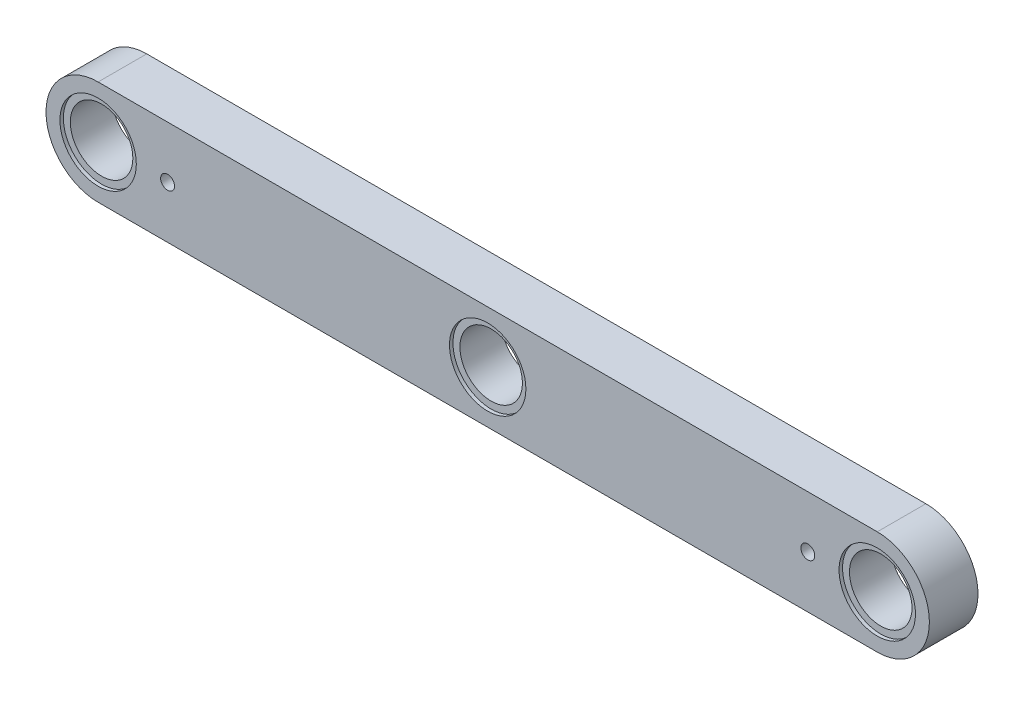
ISO-10303-21;
HEADER;
FILE_DESCRIPTION(('STEP AP214'),'2;1');
FILE_NAME('part.step','',(''),(''),'','','');
FILE_SCHEMA(('AUTOMOTIVE_DESIGN { 1 0 10303 214 1 1 1 1 }'));
ENDSEC;
DATA;
#1=APPLICATION_CONTEXT('core data for automotive mechanical design processes');
#2=APPLICATION_PROTOCOL_DEFINITION('international standard','automotive_design',2000,#1);
#3=PRODUCT_CONTEXT('',#1,'mechanical');
#4=PRODUCT('Part','Part','',(#3));
#5=PRODUCT_RELATED_PRODUCT_CATEGORY('part','',(#4));
#6=PRODUCT_DEFINITION_FORMATION('','',#4);
#7=PRODUCT_DEFINITION_CONTEXT('part definition',#1,'design');
#8=PRODUCT_DEFINITION('design','',#6,#7);
#9=PRODUCT_DEFINITION_SHAPE('','',#8);
#10=(LENGTH_UNIT() NAMED_UNIT(*) SI_UNIT(.MILLI.,.METRE.));
#11=(NAMED_UNIT(*) PLANE_ANGLE_UNIT() SI_UNIT($,.RADIAN.));
#12=(NAMED_UNIT(*) SI_UNIT($,.STERADIAN.) SOLID_ANGLE_UNIT());
#13=UNCERTAINTY_MEASURE_WITH_UNIT(LENGTH_MEASURE(1.E-05),#10,'distance_accuracy_value','');
#14=(GEOMETRIC_REPRESENTATION_CONTEXT(3) GLOBAL_UNCERTAINTY_ASSIGNED_CONTEXT((#13)) GLOBAL_UNIT_ASSIGNED_CONTEXT((#10,
#11,#12)) REPRESENTATION_CONTEXT('',''));
#15=CARTESIAN_POINT('',(0.,0.,0.));
#16=DIRECTION('',(0.,0.,1.));
#17=DIRECTION('',(1.,0.,0.));
#18=AXIS2_PLACEMENT_3D('',#15,#16,#17);
#19=CARTESIAN_POINT('',(-112.155,0.,-7.));
#20=DIRECTION('',(0.,0.,1.));
#21=DIRECTION('',(-1.,0.,0.));
#22=AXIS2_PLACEMENT_3D('',#19,#20,#21);
#23=CYLINDRICAL_SURFACE('',#22,11.);
#24=CARTESIAN_POINT('',(-112.155,0.,7.));
#25=DIRECTION('',(0.,0.,1.));
#26=DIRECTION('',(1.,0.,0.));
#27=AXIS2_PLACEMENT_3D('',#24,#25,#26);
#28=CIRCLE('',#27,11.);
#29=CARTESIAN_POINT('',(-101.155,0.,7.));
#30=VERTEX_POINT('',#29);
#31=EDGE_CURVE('E197',#30,#30,#28,.T.);
#32=ORIENTED_EDGE('',*,*,#31,.T.);
#33=EDGE_LOOP('',(#32));
#34=FACE_BOUND('',#33,.T.);
#35=CARTESIAN_POINT('',(-112.155,0.,6.));
#36=DIRECTION('',(0.,0.,1.));
#37=DIRECTION('',(1.,0.,0.));
#38=AXIS2_PLACEMENT_3D('',#35,#36,#37);
#39=CIRCLE('',#38,11.);
#40=CARTESIAN_POINT('',(-101.155,0.,6.));
#41=VERTEX_POINT('',#40);
#42=EDGE_CURVE('E555',#41,#41,#39,.T.);
#43=ORIENTED_EDGE('',*,*,#42,.F.);
#44=EDGE_LOOP('',(#43));
#45=FACE_BOUND('',#44,.T.);
#46=ADVANCED_FACE('F47',(#34,#45),#23,.F.);
#47=CARTESIAN_POINT('',(0.,0.,-7.));
#48=DIRECTION('',(0.,0.,1.));
#49=DIRECTION('',(-1.,0.,0.));
#50=AXIS2_PLACEMENT_3D('',#47,#48,#49);
#51=CYLINDRICAL_SURFACE('',#50,11.);
#52=CARTESIAN_POINT('',(0.,0.,7.));
#53=DIRECTION('',(0.,0.,1.));
#54=DIRECTION('',(1.,0.,0.));
#55=AXIS2_PLACEMENT_3D('',#52,#53,#54);
#56=CIRCLE('',#55,11.);
#57=CARTESIAN_POINT('',(11.,0.,7.));
#58=VERTEX_POINT('',#57);
#59=EDGE_CURVE('E213',#58,#58,#56,.T.);
#60=ORIENTED_EDGE('',*,*,#59,.T.);
#61=EDGE_LOOP('',(#60));
#62=FACE_BOUND('',#61,.T.);
#63=CARTESIAN_POINT('',(0.,0.,6.));
#64=DIRECTION('',(0.,0.,1.));
#65=DIRECTION('',(1.,0.,0.));
#66=AXIS2_PLACEMENT_3D('',#63,#64,#65);
#67=CIRCLE('',#66,11.);
#68=CARTESIAN_POINT('',(11.,0.,6.));
#69=VERTEX_POINT('',#68);
#70=EDGE_CURVE('E162',#69,#69,#67,.T.);
#71=ORIENTED_EDGE('',*,*,#70,.F.);
#72=EDGE_LOOP('',(#71));
#73=FACE_BOUND('',#72,.T.);
#74=ADVANCED_FACE('F235',(#62,#73),#51,.F.);
#75=CARTESIAN_POINT('',(112.155,0.,-7.));
#76=DIRECTION('',(0.,0.,1.));
#77=DIRECTION('',(-1.,0.,0.));
#78=AXIS2_PLACEMENT_3D('',#75,#76,#77);
#79=CYLINDRICAL_SURFACE('',#78,11.);
#80=CARTESIAN_POINT('',(112.155,0.,7.));
#81=DIRECTION('',(0.,0.,1.));
#82=DIRECTION('',(1.,0.,0.));
#83=AXIS2_PLACEMENT_3D('',#80,#81,#82);
#84=CIRCLE('',#83,11.);
#85=CARTESIAN_POINT('',(123.155,0.,7.));
#86=VERTEX_POINT('',#85);
#87=EDGE_CURVE('E205',#86,#86,#84,.T.);
#88=ORIENTED_EDGE('',*,*,#87,.T.);
#89=EDGE_LOOP('',(#88));
#90=FACE_BOUND('',#89,.T.);
#91=CARTESIAN_POINT('',(112.155,0.,6.));
#92=DIRECTION('',(0.,0.,1.));
#93=DIRECTION('',(1.,0.,0.));
#94=AXIS2_PLACEMENT_3D('',#91,#92,#93);
#95=CIRCLE('',#94,11.);
#96=CARTESIAN_POINT('',(123.155,0.,6.));
#97=VERTEX_POINT('',#96);
#98=EDGE_CURVE('E177',#97,#97,#95,.T.);
#99=ORIENTED_EDGE('',*,*,#98,.F.);
#100=EDGE_LOOP('',(#99));
#101=FACE_BOUND('',#100,.T.);
#102=ADVANCED_FACE('F245',(#90,#101),#79,.F.);
#103=CARTESIAN_POINT('',(112.155,0.,-7.));
#104=DIRECTION('',(0.,0.,-1.));
#105=DIRECTION('',(1.,0.,0.));
#106=AXIS2_PLACEMENT_3D('',#103,#104,#105);
#107=PLANE('',#106);
#108=CARTESIAN_POINT('',(-92.155,0.,-7.));
#109=DIRECTION('',(0.,0.,1.));
#110=DIRECTION('',(1.,0.,0.));
#111=AXIS2_PLACEMENT_3D('',#108,#109,#110);
#112=CIRCLE('',#111,2.);
#113=CARTESIAN_POINT('',(-90.155,0.,-7.));
#114=VERTEX_POINT('',#113);
#115=EDGE_CURVE('E193',#114,#114,#112,.T.);
#116=ORIENTED_EDGE('',*,*,#115,.T.);
#117=EDGE_LOOP('',(#116));
#118=FACE_BOUND('',#117,.T.);
#119=CARTESIAN_POINT('',(112.155,0.,-7.));
#120=DIRECTION('',(0.,0.,1.));
#121=DIRECTION('',(1.,0.,0.));
#122=AXIS2_PLACEMENT_3D('',#119,#120,#121);
#123=CIRCLE('',#122,11.);
#124=CARTESIAN_POINT('',(123.155,0.,-7.));
#125=VERTEX_POINT('',#124);
#126=EDGE_CURVE('E209',#125,#125,#123,.T.);
#127=ORIENTED_EDGE('',*,*,#126,.T.);
#128=EDGE_LOOP('',(#127));
#129=FACE_BOUND('',#128,.T.);
#130=CARTESIAN_POINT('',(112.155,0.,-7.));
#131=DIRECTION('',(0.,0.,1.));
#132=DIRECTION('',(1.,0.,0.));
#133=AXIS2_PLACEMENT_3D('',#130,#131,#132);
#134=CIRCLE('',#133,15.);
#135=CARTESIAN_POINT('',(112.155,-14.9999999999999,-7.));
#136=VERTEX_POINT('',#135);
#137=CARTESIAN_POINT('',(112.155,15.,-7.));
#138=VERTEX_POINT('',#137);
#139=EDGE_CURVE('E110',#136,#138,#134,.T.);
#140=ORIENTED_EDGE('',*,*,#139,.F.);
#141=DIRECTION('',(1.,0.,0.));
#142=VECTOR('',#141,1.);
#143=CARTESIAN_POINT('',(112.155,-14.9999999999999,-7.));
#144=LINE('',#143,#142);
#145=CARTESIAN_POINT('',(-112.155,-15.,-7.));
#146=VERTEX_POINT('',#145);
#147=EDGE_CURVE('E114',#146,#136,#144,.T.);
#148=ORIENTED_EDGE('',*,*,#147,.F.);
#149=CARTESIAN_POINT('',(-112.155,0.,-7.));
#150=DIRECTION('',(0.,0.,1.));
#151=DIRECTION('',(1.,0.,0.));
#152=AXIS2_PLACEMENT_3D('',#149,#150,#151);
#153=CIRCLE('',#152,15.);
#154=CARTESIAN_POINT('',(-112.155,15.,-7.));
#155=VERTEX_POINT('',#154);
#156=EDGE_CURVE('E98',#155,#146,#153,.T.);
#157=ORIENTED_EDGE('',*,*,#156,.F.);
#158=DIRECTION('',(-1.,0.,0.));
#159=VECTOR('',#158,1.);
#160=CARTESIAN_POINT('',(112.155,15.,-7.));
#161=LINE('',#160,#159);
#162=EDGE_CURVE('E105',#138,#155,#161,.T.);
#163=ORIENTED_EDGE('',*,*,#162,.F.);
#164=EDGE_LOOP('',(#140,#148,#157,#163));
#165=FACE_BOUND('',#164,.T.);
#166=CARTESIAN_POINT('',(0.,0.,-7.));
#167=DIRECTION('',(0.,0.,1.));
#168=DIRECTION('',(1.,0.,0.));
#169=AXIS2_PLACEMENT_3D('',#166,#167,#168);
#170=CIRCLE('',#169,11.);
#171=CARTESIAN_POINT('',(11.,0.,-7.));
#172=VERTEX_POINT('',#171);
#173=EDGE_CURVE('E126',#172,#172,#170,.T.);
#174=ORIENTED_EDGE('',*,*,#173,.T.);
#175=EDGE_LOOP('',(#174));
#176=FACE_BOUND('',#175,.T.);
#177=CARTESIAN_POINT('',(-112.155,0.,-7.));
#178=DIRECTION('',(0.,0.,1.));
#179=DIRECTION('',(1.,0.,0.));
#180=AXIS2_PLACEMENT_3D('',#177,#178,#179);
#181=CIRCLE('',#180,11.);
#182=CARTESIAN_POINT('',(-101.155,0.,-7.));
#183=VERTEX_POINT('',#182);
#184=EDGE_CURVE('E201',#183,#183,#181,.T.);
#185=ORIENTED_EDGE('',*,*,#184,.T.);
#186=EDGE_LOOP('',(#185));
#187=FACE_BOUND('',#186,.T.);
#188=CARTESIAN_POINT('',(92.155,0.,-7.));
#189=DIRECTION('',(0.,0.,1.));
#190=DIRECTION('',(1.,0.,0.));
#191=AXIS2_PLACEMENT_3D('',#188,#189,#190);
#192=CIRCLE('',#191,2.);
#193=CARTESIAN_POINT('',(94.155,0.,-7.));
#194=VERTEX_POINT('',#193);
#195=EDGE_CURVE('E185',#194,#194,#192,.T.);
#196=ORIENTED_EDGE('',*,*,#195,.T.);
#197=EDGE_LOOP('',(#196));
#198=FACE_BOUND('',#197,.T.);
#199=ADVANCED_FACE('F112',(#118,#129,#165,#176,#187,#198),#107,.T.);
#200=CARTESIAN_POINT('',(112.155,0.,7.));
#201=DIRECTION('',(0.,0.,-1.));
#202=DIRECTION('',(1.,0.,0.));
#203=AXIS2_PLACEMENT_3D('',#200,#201,#202);
#204=PLANE('',#203);
#205=CARTESIAN_POINT('',(112.155,0.,7.));
#206=DIRECTION('',(0.,0.,1.));
#207=DIRECTION('',(1.,0.,0.));
#208=AXIS2_PLACEMENT_3D('',#205,#206,#207);
#209=CIRCLE('',#208,15.);
#210=CARTESIAN_POINT('',(112.155,-14.9999999999999,7.));
#211=VERTEX_POINT('',#210);
#212=CARTESIAN_POINT('',(112.155,15.,7.));
#213=VERTEX_POINT('',#212);
#214=EDGE_CURVE('E121',#211,#213,#209,.T.);
#215=ORIENTED_EDGE('',*,*,#214,.T.);
#216=DIRECTION('',(-1.,0.,0.));
#217=VECTOR('',#216,1.);
#218=CARTESIAN_POINT('',(112.155,15.,7.));
#219=LINE('',#218,#217);
#220=CARTESIAN_POINT('',(-112.155,15.,7.));
#221=VERTEX_POINT('',#220);
#222=EDGE_CURVE('E125',#213,#221,#219,.T.);
#223=ORIENTED_EDGE('',*,*,#222,.T.);
#224=CARTESIAN_POINT('',(-112.155,0.,7.));
#225=DIRECTION('',(0.,0.,1.));
#226=DIRECTION('',(1.,0.,0.));
#227=AXIS2_PLACEMENT_3D('',#224,#225,#226);
#228=CIRCLE('',#227,15.);
#229=CARTESIAN_POINT('',(-112.155,-15.,7.));
#230=VERTEX_POINT('',#229);
#231=EDGE_CURVE('E101',#221,#230,#228,.T.);
#232=ORIENTED_EDGE('',*,*,#231,.T.);
#233=DIRECTION('',(1.,0.,0.));
#234=VECTOR('',#233,1.);
#235=CARTESIAN_POINT('',(112.155,-14.9999999999999,7.));
#236=LINE('',#235,#234);
#237=EDGE_CURVE('E131',#230,#211,#236,.T.);
#238=ORIENTED_EDGE('',*,*,#237,.T.);
#239=EDGE_LOOP('',(#215,#223,#232,#238));
#240=FACE_BOUND('',#239,.T.);
#241=ORIENTED_EDGE('',*,*,#59,.F.);
#242=EDGE_LOOP('',(#241));
#243=FACE_BOUND('',#242,.T.);
#244=ORIENTED_EDGE('',*,*,#87,.F.);
#245=EDGE_LOOP('',(#244));
#246=FACE_BOUND('',#245,.T.);
#247=ORIENTED_EDGE('',*,*,#31,.F.);
#248=EDGE_LOOP('',(#247));
#249=FACE_BOUND('',#248,.T.);
#250=CARTESIAN_POINT('',(-92.155,0.,7.));
#251=DIRECTION('',(0.,0.,1.));
#252=DIRECTION('',(1.,0.,0.));
#253=AXIS2_PLACEMENT_3D('',#250,#251,#252);
#254=CIRCLE('',#253,2.);
#255=CARTESIAN_POINT('',(-90.155,0.,7.));
#256=VERTEX_POINT('',#255);
#257=EDGE_CURVE('E189',#256,#256,#254,.T.);
#258=ORIENTED_EDGE('',*,*,#257,.F.);
#259=EDGE_LOOP('',(#258));
#260=FACE_BOUND('',#259,.T.);
#261=CARTESIAN_POINT('',(92.155,0.,7.));
#262=DIRECTION('',(0.,0.,1.));
#263=DIRECTION('',(1.,0.,0.));
#264=AXIS2_PLACEMENT_3D('',#261,#262,#263);
#265=CIRCLE('',#264,2.);
#266=CARTESIAN_POINT('',(94.155,0.,7.));
#267=VERTEX_POINT('',#266);
#268=EDGE_CURVE('E184',#267,#267,#265,.T.);
#269=ORIENTED_EDGE('',*,*,#268,.F.);
#270=EDGE_LOOP('',(#269));
#271=FACE_BOUND('',#270,.T.);
#272=ADVANCED_FACE('F224',(#240,#243,#246,#249,#260,#271),#204,.F.);
#273=CARTESIAN_POINT('',(112.155,0.,-7.));
#274=DIRECTION('',(0.,0.,1.));
#275=DIRECTION('',(-1.,0.,0.));
#276=AXIS2_PLACEMENT_3D('',#273,#274,#275);
#277=CYLINDRICAL_SURFACE('',#276,15.);
#278=ORIENTED_EDGE('',*,*,#214,.F.);
#279=DIRECTION('',(0.,0.,1.));
#280=VECTOR('',#279,1.);
#281=CARTESIAN_POINT('',(112.155,-14.9999999999999,-7.));
#282=LINE('',#281,#280);
#283=EDGE_CURVE('E65',#136,#211,#282,.T.);
#284=ORIENTED_EDGE('',*,*,#283,.F.);
#285=ORIENTED_EDGE('',*,*,#139,.T.);
#286=DIRECTION('',(0.,0.,1.));
#287=VECTOR('',#286,1.);
#288=CARTESIAN_POINT('',(112.155,15.,-7.));
#289=LINE('',#288,#287);
#290=EDGE_CURVE('E92',#138,#213,#289,.T.);
#291=ORIENTED_EDGE('',*,*,#290,.T.);
#292=EDGE_LOOP('',(#278,#284,#285,#291));
#293=FACE_BOUND('',#292,.T.);
#294=ADVANCED_FACE('F49',(#293),#277,.T.);
#295=CARTESIAN_POINT('',(112.155,15.,-7.));
#296=DIRECTION('',(0.,-1.,0.));
#297=DIRECTION('',(1.,0.,0.));
#298=AXIS2_PLACEMENT_3D('',#295,#296,#297);
#299=PLANE('',#298);
#300=ORIENTED_EDGE('',*,*,#222,.F.);
#301=ORIENTED_EDGE('',*,*,#290,.F.);
#302=ORIENTED_EDGE('',*,*,#162,.T.);
#303=DIRECTION('',(0.,0.,1.));
#304=VECTOR('',#303,1.);
#305=CARTESIAN_POINT('',(-112.155,15.,-7.));
#306=LINE('',#305,#304);
#307=EDGE_CURVE('E95',#155,#221,#306,.T.);
#308=ORIENTED_EDGE('',*,*,#307,.T.);
#309=EDGE_LOOP('',(#300,#301,#302,#308));
#310=FACE_BOUND('',#309,.T.);
#311=ADVANCED_FACE('F106',(#310),#299,.F.);
#312=CARTESIAN_POINT('',(-112.155,0.,-7.));
#313=DIRECTION('',(0.,0.,1.));
#314=DIRECTION('',(-1.,0.,0.));
#315=AXIS2_PLACEMENT_3D('',#312,#313,#314);
#316=CYLINDRICAL_SURFACE('',#315,15.);
#317=ORIENTED_EDGE('',*,*,#231,.F.);
#318=ORIENTED_EDGE('',*,*,#307,.F.);
#319=ORIENTED_EDGE('',*,*,#156,.T.);
#320=DIRECTION('',(0.,0.,1.));
#321=VECTOR('',#320,1.);
#322=CARTESIAN_POINT('',(-112.155,-15.,-7.));
#323=LINE('',#322,#321);
#324=EDGE_CURVE('E82',#146,#230,#323,.T.);
#325=ORIENTED_EDGE('',*,*,#324,.T.);
#326=EDGE_LOOP('',(#317,#318,#319,#325));
#327=FACE_BOUND('',#326,.T.);
#328=ADVANCED_FACE('F96',(#327),#316,.T.);
#329=CARTESIAN_POINT('',(112.155,-14.9999999999999,-7.));
#330=DIRECTION('',(0.,1.,0.));
#331=DIRECTION('',(-1.,0.,0.));
#332=AXIS2_PLACEMENT_3D('',#329,#330,#331);
#333=PLANE('',#332);
#334=ORIENTED_EDGE('',*,*,#237,.F.);
#335=ORIENTED_EDGE('',*,*,#324,.F.);
#336=ORIENTED_EDGE('',*,*,#147,.T.);
#337=ORIENTED_EDGE('',*,*,#283,.T.);
#338=EDGE_LOOP('',(#334,#335,#336,#337));
#339=FACE_BOUND('',#338,.T.);
#340=ADVANCED_FACE('F226',(#339),#333,.F.);
#341=CARTESIAN_POINT('',(0.,0.,-6.));
#342=DIRECTION('',(0.,0.,1.));
#343=DIRECTION('',(1.,0.,0.));
#344=AXIS2_PLACEMENT_3D('',#341,#342,#343);
#345=CIRCLE('',#344,11.);
#346=CARTESIAN_POINT('',(11.,0.,-6.));
#347=VERTEX_POINT('',#346);
#348=EDGE_CURVE('E57',#347,#347,#345,.T.);
#349=ORIENTED_EDGE('',*,*,#348,.T.);
#350=EDGE_LOOP('',(#349));
#351=FACE_BOUND('',#350,.T.);
#352=ORIENTED_EDGE('',*,*,#173,.F.);
#353=EDGE_LOOP('',(#352));
#354=FACE_BOUND('',#353,.T.);
#355=ADVANCED_FACE('F147',(#351,#354),#51,.F.);
#356=CARTESIAN_POINT('',(112.155,0.,-6.));
#357=DIRECTION('',(0.,0.,1.));
#358=DIRECTION('',(1.,0.,0.));
#359=AXIS2_PLACEMENT_3D('',#356,#357,#358);
#360=CIRCLE('',#359,11.);
#361=CARTESIAN_POINT('',(123.155,0.,-6.));
#362=VERTEX_POINT('',#361);
#363=EDGE_CURVE('E140',#362,#362,#360,.T.);
#364=ORIENTED_EDGE('',*,*,#363,.T.);
#365=EDGE_LOOP('',(#364));
#366=FACE_BOUND('',#365,.T.);
#367=ORIENTED_EDGE('',*,*,#126,.F.);
#368=EDGE_LOOP('',(#367));
#369=FACE_BOUND('',#368,.T.);
#370=ADVANCED_FACE('F233',(#366,#369),#79,.F.);
#371=CARTESIAN_POINT('',(-112.155,0.,-6.));
#372=DIRECTION('',(0.,0.,1.));
#373=DIRECTION('',(1.,0.,0.));
#374=AXIS2_PLACEMENT_3D('',#371,#372,#373);
#375=CIRCLE('',#374,11.);
#376=CARTESIAN_POINT('',(-101.155,0.,-6.));
#377=VERTEX_POINT('',#376);
#378=EDGE_CURVE('E11',#377,#377,#375,.T.);
#379=ORIENTED_EDGE('',*,*,#378,.T.);
#380=EDGE_LOOP('',(#379));
#381=FACE_BOUND('',#380,.T.);
#382=ORIENTED_EDGE('',*,*,#184,.F.);
#383=EDGE_LOOP('',(#382));
#384=FACE_BOUND('',#383,.T.);
#385=ADVANCED_FACE('F241',(#381,#384),#23,.F.);
#386=CARTESIAN_POINT('',(-92.155,0.,-7.));
#387=DIRECTION('',(0.,0.,1.));
#388=DIRECTION('',(-1.,0.,0.));
#389=AXIS2_PLACEMENT_3D('',#386,#387,#388);
#390=CYLINDRICAL_SURFACE('',#389,2.);
#391=ORIENTED_EDGE('',*,*,#115,.F.);
#392=EDGE_LOOP('',(#391));
#393=FACE_BOUND('',#392,.T.);
#394=ORIENTED_EDGE('',*,*,#257,.T.);
#395=EDGE_LOOP('',(#394));
#396=FACE_BOUND('',#395,.T.);
#397=ADVANCED_FACE('F251',(#393,#396),#390,.F.);
#398=CARTESIAN_POINT('',(92.155,0.,-7.));
#399=DIRECTION('',(0.,0.,1.));
#400=DIRECTION('',(-1.,0.,0.));
#401=AXIS2_PLACEMENT_3D('',#398,#399,#400);
#402=CYLINDRICAL_SURFACE('',#401,2.);
#403=ORIENTED_EDGE('',*,*,#195,.F.);
#404=EDGE_LOOP('',(#403));
#405=FACE_BOUND('',#404,.T.);
#406=ORIENTED_EDGE('',*,*,#268,.T.);
#407=EDGE_LOOP('',(#406));
#408=FACE_BOUND('',#407,.T.);
#409=ADVANCED_FACE('F257',(#405,#408),#402,.F.);
#410=CARTESIAN_POINT('',(112.155,0.,-6.));
#411=DIRECTION('',(0.,0.,-1.));
#412=DIRECTION('',(1.,0.,0.));
#413=AXIS2_PLACEMENT_3D('',#410,#411,#412);
#414=PLANE('',#413);
#415=ORIENTED_EDGE('',*,*,#363,.F.);
#416=EDGE_LOOP('',(#415));
#417=FACE_BOUND('',#416,.T.);
#418=CARTESIAN_POINT('',(112.155,0.,-6.));
#419=DIRECTION('',(0.,0.,1.));
#420=DIRECTION('',(1.,0.,0.));
#421=AXIS2_PLACEMENT_3D('',#418,#419,#420);
#422=CIRCLE('',#421,9.);
#423=CARTESIAN_POINT('',(121.155,0.,-6.));
#424=VERTEX_POINT('',#423);
#425=EDGE_CURVE('E173',#424,#424,#422,.T.);
#426=ORIENTED_EDGE('',*,*,#425,.T.);
#427=EDGE_LOOP('',(#426));
#428=FACE_BOUND('',#427,.T.);
#429=ADVANCED_FACE('F272',(#417,#428),#414,.T.);
#430=CARTESIAN_POINT('',(112.155,0.,6.));
#431=DIRECTION('',(0.,0.,-1.));
#432=DIRECTION('',(1.,0.,0.));
#433=AXIS2_PLACEMENT_3D('',#430,#431,#432);
#434=PLANE('',#433);
#435=ORIENTED_EDGE('',*,*,#98,.T.);
#436=EDGE_LOOP('',(#435));
#437=FACE_BOUND('',#436,.T.);
#438=CARTESIAN_POINT('',(112.155,0.,6.));
#439=DIRECTION('',(0.,0.,1.));
#440=DIRECTION('',(1.,0.,0.));
#441=AXIS2_PLACEMENT_3D('',#438,#439,#440);
#442=CIRCLE('',#441,9.);
#443=CARTESIAN_POINT('',(121.155,0.,6.));
#444=VERTEX_POINT('',#443);
#445=EDGE_CURVE('E167',#444,#444,#442,.T.);
#446=ORIENTED_EDGE('',*,*,#445,.F.);
#447=EDGE_LOOP('',(#446));
#448=FACE_BOUND('',#447,.T.);
#449=ADVANCED_FACE('F330',(#437,#448),#434,.F.);
#450=CARTESIAN_POINT('',(112.155,0.,-6.));
#451=DIRECTION('',(0.,0.,1.));
#452=DIRECTION('',(-1.,0.,0.));
#453=AXIS2_PLACEMENT_3D('',#450,#451,#452);
#454=CYLINDRICAL_SURFACE('',#453,9.);
#455=ORIENTED_EDGE('',*,*,#425,.F.);
#456=EDGE_LOOP('',(#455));
#457=FACE_BOUND('',#456,.T.);
#458=ORIENTED_EDGE('',*,*,#445,.T.);
#459=EDGE_LOOP('',(#458));
#460=FACE_BOUND('',#459,.T.);
#461=ADVANCED_FACE('F154',(#457,#460),#454,.F.);
#462=CARTESIAN_POINT('',(0.,0.,-6.));
#463=DIRECTION('',(0.,0.,-1.));
#464=DIRECTION('',(1.,0.,0.));
#465=AXIS2_PLACEMENT_3D('',#462,#463,#464);
#466=PLANE('',#465);
#467=ORIENTED_EDGE('',*,*,#348,.F.);
#468=EDGE_LOOP('',(#467));
#469=FACE_BOUND('',#468,.T.);
#470=CARTESIAN_POINT('',(0.,0.,-6.));
#471=DIRECTION('',(0.,0.,1.));
#472=DIRECTION('',(1.,0.,0.));
#473=AXIS2_PLACEMENT_3D('',#470,#471,#472);
#474=CIRCLE('',#473,9.);
#475=CARTESIAN_POINT('',(9.,0.,-6.));
#476=VERTEX_POINT('',#475);
#477=EDGE_CURVE('E158',#476,#476,#474,.T.);
#478=ORIENTED_EDGE('',*,*,#477,.T.);
#479=EDGE_LOOP('',(#478));
#480=FACE_BOUND('',#479,.T.);
#481=ADVANCED_FACE('F150',(#469,#480),#466,.T.);
#482=CARTESIAN_POINT('',(0.,0.,6.));
#483=DIRECTION('',(0.,0.,-1.));
#484=DIRECTION('',(1.,0.,0.));
#485=AXIS2_PLACEMENT_3D('',#482,#483,#484);
#486=PLANE('',#485);
#487=ORIENTED_EDGE('',*,*,#70,.T.);
#488=EDGE_LOOP('',(#487));
#489=FACE_BOUND('',#488,.T.);
#490=CARTESIAN_POINT('',(0.,0.,6.));
#491=DIRECTION('',(0.,0.,1.));
#492=DIRECTION('',(1.,0.,0.));
#493=AXIS2_PLACEMENT_3D('',#490,#491,#492);
#494=CIRCLE('',#493,9.);
#495=CARTESIAN_POINT('',(9.,0.,6.));
#496=VERTEX_POINT('',#495);
#497=EDGE_CURVE('E161',#496,#496,#494,.T.);
#498=ORIENTED_EDGE('',*,*,#497,.F.);
#499=EDGE_LOOP('',(#498));
#500=FACE_BOUND('',#499,.T.);
#501=ADVANCED_FACE('F153',(#489,#500),#486,.F.);
#502=CARTESIAN_POINT('',(0.,0.,-6.));
#503=DIRECTION('',(0.,0.,1.));
#504=DIRECTION('',(-1.,0.,0.));
#505=AXIS2_PLACEMENT_3D('',#502,#503,#504);
#506=CYLINDRICAL_SURFACE('',#505,9.);
#507=ORIENTED_EDGE('',*,*,#477,.F.);
#508=EDGE_LOOP('',(#507));
#509=FACE_BOUND('',#508,.T.);
#510=ORIENTED_EDGE('',*,*,#497,.T.);
#511=EDGE_LOOP('',(#510));
#512=FACE_BOUND('',#511,.T.);
#513=ADVANCED_FACE('F364',(#509,#512),#506,.F.);
#514=CARTESIAN_POINT('',(-112.155,0.,-6.));
#515=DIRECTION('',(0.,0.,-1.));
#516=DIRECTION('',(1.,0.,0.));
#517=AXIS2_PLACEMENT_3D('',#514,#515,#516);
#518=PLANE('',#517);
#519=ORIENTED_EDGE('',*,*,#378,.F.);
#520=EDGE_LOOP('',(#519));
#521=FACE_BOUND('',#520,.T.);
#522=CARTESIAN_POINT('',(-112.155,0.,-6.));
#523=DIRECTION('',(0.,0.,1.));
#524=DIRECTION('',(1.,0.,0.));
#525=AXIS2_PLACEMENT_3D('',#522,#523,#524);
#526=CIRCLE('',#525,9.);
#527=CARTESIAN_POINT('',(-103.155,0.,-6.));
#528=VERTEX_POINT('',#527);
#529=EDGE_CURVE('E548',#528,#528,#526,.T.);
#530=ORIENTED_EDGE('',*,*,#529,.T.);
#531=EDGE_LOOP('',(#530));
#532=FACE_BOUND('',#531,.T.);
#533=ADVANCED_FACE('F374',(#521,#532),#518,.T.);
#534=CARTESIAN_POINT('',(-112.155,0.,6.));
#535=DIRECTION('',(0.,0.,-1.));
#536=DIRECTION('',(1.,0.,0.));
#537=AXIS2_PLACEMENT_3D('',#534,#535,#536);
#538=PLANE('',#537);
#539=ORIENTED_EDGE('',*,*,#42,.T.);
#540=EDGE_LOOP('',(#539));
#541=FACE_BOUND('',#540,.T.);
#542=CARTESIAN_POINT('',(-112.155,0.,6.));
#543=DIRECTION('',(0.,0.,1.));
#544=DIRECTION('',(1.,0.,0.));
#545=AXIS2_PLACEMENT_3D('',#542,#543,#544);
#546=CIRCLE('',#545,9.);
#547=CARTESIAN_POINT('',(-103.155,0.,6.));
#548=VERTEX_POINT('',#547);
#549=EDGE_CURVE('E170',#548,#548,#546,.T.);
#550=ORIENTED_EDGE('',*,*,#549,.F.);
#551=EDGE_LOOP('',(#550));
#552=FACE_BOUND('',#551,.T.);
#553=ADVANCED_FACE('F383',(#541,#552),#538,.F.);
#554=CARTESIAN_POINT('',(-112.155,0.,-6.));
#555=DIRECTION('',(0.,0.,1.));
#556=DIRECTION('',(-1.,0.,0.));
#557=AXIS2_PLACEMENT_3D('',#554,#555,#556);
#558=CYLINDRICAL_SURFACE('',#557,9.);
#559=ORIENTED_EDGE('',*,*,#529,.F.);
#560=EDGE_LOOP('',(#559));
#561=FACE_BOUND('',#560,.T.);
#562=ORIENTED_EDGE('',*,*,#549,.T.);
#563=EDGE_LOOP('',(#562));
#564=FACE_BOUND('',#563,.T.);
#565=ADVANCED_FACE('F393',(#561,#564),#558,.F.);
#566=CLOSED_SHELL('',(#46,#74,#102,#199,#272,#294,#311,#328,#340,#355,#370,#385,#397,#409,#429,
#449,#461,#481,#501,#513,#533,#553,#565));
#567=MANIFOLD_SOLID_BREP('B2',#566);
#568=ADVANCED_BREP_SHAPE_REPRESENTATION('',(#18,#567),#14);
#569=SHAPE_DEFINITION_REPRESENTATION(#9,#568);
ENDSEC;
END-ISO-10303-21;
